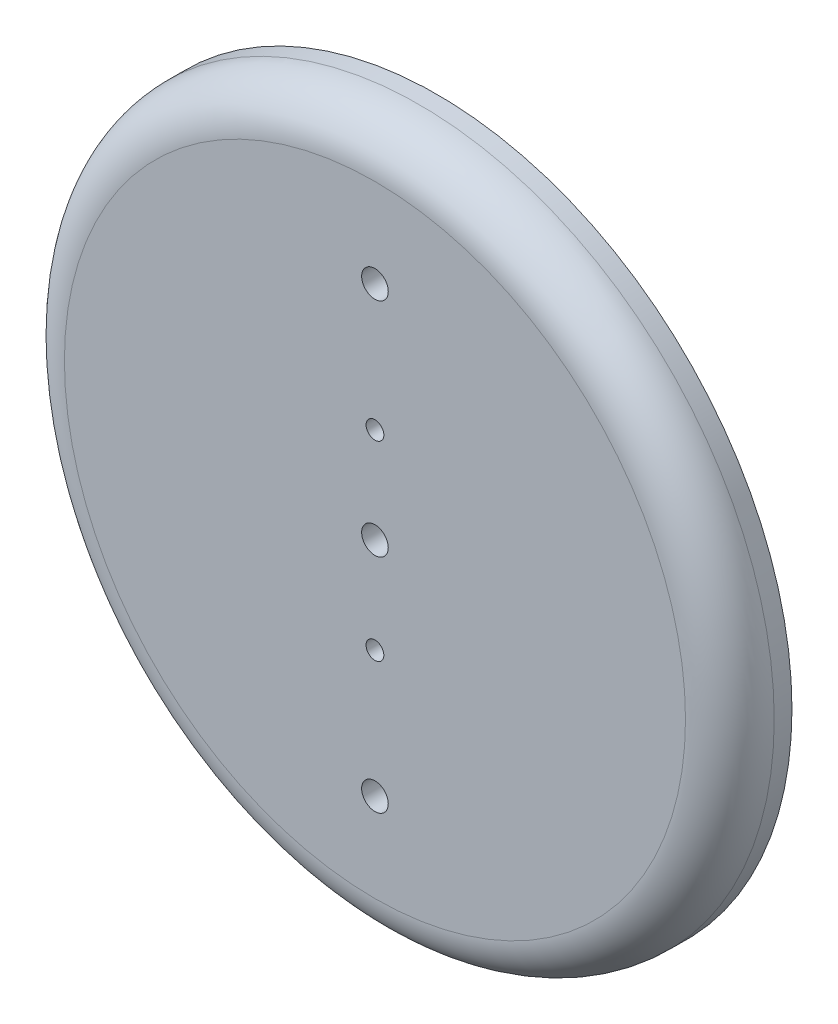
ISO-10303-21;
HEADER;
FILE_DESCRIPTION(('STEP AP214'),'2;1');
FILE_NAME('part.step','',(''),(''),'','','');
FILE_SCHEMA(('AUTOMOTIVE_DESIGN { 1 0 10303 214 1 1 1 1 }'));
ENDSEC;
DATA;
#1=APPLICATION_CONTEXT('core data for automotive mechanical design processes');
#2=APPLICATION_PROTOCOL_DEFINITION('international standard','automotive_design',2000,#1);
#3=PRODUCT_CONTEXT('',#1,'mechanical');
#4=PRODUCT('Part','Part','',(#3));
#5=PRODUCT_RELATED_PRODUCT_CATEGORY('part','',(#4));
#6=PRODUCT_DEFINITION_FORMATION('','',#4);
#7=PRODUCT_DEFINITION_CONTEXT('part definition',#1,'design');
#8=PRODUCT_DEFINITION('design','',#6,#7);
#9=PRODUCT_DEFINITION_SHAPE('','',#8);
#10=(LENGTH_UNIT() NAMED_UNIT(*) SI_UNIT(.MILLI.,.METRE.));
#11=(NAMED_UNIT(*) PLANE_ANGLE_UNIT() SI_UNIT($,.RADIAN.));
#12=(NAMED_UNIT(*) SI_UNIT($,.STERADIAN.) SOLID_ANGLE_UNIT());
#13=UNCERTAINTY_MEASURE_WITH_UNIT(LENGTH_MEASURE(1.E-05),#10,'distance_accuracy_value','');
#14=(GEOMETRIC_REPRESENTATION_CONTEXT(3) GLOBAL_UNCERTAINTY_ASSIGNED_CONTEXT((#13)) GLOBAL_UNIT_ASSIGNED_CONTEXT((#10,
#11,#12)) REPRESENTATION_CONTEXT('',''));
#15=CARTESIAN_POINT('',(0.,0.,0.));
#16=DIRECTION('',(0.,0.,1.));
#17=DIRECTION('',(1.,0.,0.));
#18=AXIS2_PLACEMENT_3D('',#15,#16,#17);
#19=CARTESIAN_POINT('',(0.,0.,7.));
#20=DIRECTION('',(0.,0.,-1.));
#21=DIRECTION('',(-1.,0.,0.));
#22=AXIS2_PLACEMENT_3D('',#19,#20,#21);
#23=CYLINDRICAL_SURFACE('',#22,40.);
#24=CARTESIAN_POINT('',(0.,0.,2.));
#25=DIRECTION('',(0.,0.,1.));
#26=DIRECTION('',(1.,0.,0.));
#27=AXIS2_PLACEMENT_3D('',#24,#25,#26);
#28=CIRCLE('',#27,40.);
#29=CARTESIAN_POINT('',(40.,0.,2.));
#30=VERTEX_POINT('',#29);
#31=EDGE_CURVE('E10',#30,#30,#28,.F.);
#32=ORIENTED_EDGE('',*,*,#31,.T.);
#33=EDGE_LOOP('',(#32));
#34=FACE_BOUND('',#33,.T.);
#35=CARTESIAN_POINT('',(0.,0.,0.));
#36=DIRECTION('',(0.,0.,1.));
#37=DIRECTION('',(1.,0.,0.));
#38=AXIS2_PLACEMENT_3D('',#35,#36,#37);
#39=CIRCLE('',#38,40.);
#40=CARTESIAN_POINT('',(40.,0.,0.));
#41=VERTEX_POINT('',#40);
#42=EDGE_CURVE('E54',#41,#41,#39,.T.);
#43=ORIENTED_EDGE('',*,*,#42,.T.);
#44=EDGE_LOOP('',(#43));
#45=FACE_BOUND('',#44,.T.);
#46=ADVANCED_FACE('F39',(#34,#45),#23,.T.);
#47=CARTESIAN_POINT('',(0.,0.,7.));
#48=DIRECTION('',(0.,0.,1.));
#49=DIRECTION('',(1.,0.,0.));
#50=AXIS2_PLACEMENT_3D('',#47,#48,#49);
#51=PLANE('',#50);
#52=CARTESIAN_POINT('',(0.,0.,7.));
#53=DIRECTION('',(0.,0.,1.));
#54=DIRECTION('',(1.,0.,0.));
#55=AXIS2_PLACEMENT_3D('',#52,#53,#54);
#56=CIRCLE('',#55,1.5);
#57=CARTESIAN_POINT('',(1.5,0.,7.));
#58=VERTEX_POINT('',#57);
#59=EDGE_CURVE('E198',#58,#58,#56,.T.);
#60=ORIENTED_EDGE('',*,*,#59,.F.);
#61=EDGE_LOOP('',(#60));
#62=FACE_BOUND('',#61,.T.);
#63=CARTESIAN_POINT('',(0.,10.75,7.));
#64=DIRECTION('',(0.,0.,1.));
#65=DIRECTION('',(1.,0.,0.));
#66=AXIS2_PLACEMENT_3D('',#63,#64,#65);
#67=CIRCLE('',#66,1.);
#68=CARTESIAN_POINT('',(1.,10.75,7.));
#69=VERTEX_POINT('',#68);
#70=EDGE_CURVE('E71',#69,#69,#67,.T.);
#71=ORIENTED_EDGE('',*,*,#70,.F.);
#72=EDGE_LOOP('',(#71));
#73=FACE_BOUND('',#72,.T.);
#74=CARTESIAN_POINT('',(0.,-10.75,7.));
#75=DIRECTION('',(0.,0.,1.));
#76=DIRECTION('',(-1.,0.,0.));
#77=AXIS2_PLACEMENT_3D('',#74,#75,#76);
#78=CIRCLE('',#77,1.);
#79=CARTESIAN_POINT('',(-1.,-10.75,7.));
#80=VERTEX_POINT('',#79);
#81=EDGE_CURVE('E189',#80,#80,#78,.T.);
#82=ORIENTED_EDGE('',*,*,#81,.F.);
#83=EDGE_LOOP('',(#82));
#84=FACE_BOUND('',#83,.T.);
#85=CARTESIAN_POINT('',(0.,25.,7.));
#86=DIRECTION('',(0.,0.,1.));
#87=DIRECTION('',(1.,0.,0.));
#88=AXIS2_PLACEMENT_3D('',#85,#86,#87);
#89=CIRCLE('',#88,1.5);
#90=CARTESIAN_POINT('',(1.5,25.,7.));
#91=VERTEX_POINT('',#90);
#92=EDGE_CURVE('E63',#91,#91,#89,.T.);
#93=ORIENTED_EDGE('',*,*,#92,.F.);
#94=EDGE_LOOP('',(#93));
#95=FACE_BOUND('',#94,.T.);
#96=CARTESIAN_POINT('',(0.,-25.,7.));
#97=DIRECTION('',(0.,0.,1.));
#98=DIRECTION('',(-1.,0.,0.));
#99=AXIS2_PLACEMENT_3D('',#96,#97,#98);
#100=CIRCLE('',#99,1.5);
#101=CARTESIAN_POINT('',(-1.5,-25.,7.));
#102=VERTEX_POINT('',#101);
#103=EDGE_CURVE('E74',#102,#102,#100,.T.);
#104=ORIENTED_EDGE('',*,*,#103,.F.);
#105=EDGE_LOOP('',(#104));
#106=FACE_BOUND('',#105,.T.);
#107=CARTESIAN_POINT('',(0.,0.,7.));
#108=DIRECTION('',(0.,0.,1.));
#109=DIRECTION('',(1.,0.,0.));
#110=AXIS2_PLACEMENT_3D('',#107,#108,#109);
#111=CIRCLE('',#110,35.);
#112=CARTESIAN_POINT('',(35.,0.,7.));
#113=VERTEX_POINT('',#112);
#114=EDGE_CURVE('E48',#113,#113,#111,.T.);
#115=ORIENTED_EDGE('',*,*,#114,.T.);
#116=EDGE_LOOP('',(#115));
#117=FACE_BOUND('',#116,.T.);
#118=ADVANCED_FACE('F93',(#62,#73,#84,#95,#106,#117),#51,.T.);
#119=CARTESIAN_POINT('',(0.,0.,0.));
#120=DIRECTION('',(0.,0.,1.));
#121=DIRECTION('',(1.,0.,0.));
#122=AXIS2_PLACEMENT_3D('',#119,#120,#121);
#123=PLANE('',#122);
#124=CARTESIAN_POINT('',(0.,0.,0.));
#125=DIRECTION('',(0.,0.,1.));
#126=DIRECTION('',(1.,0.,0.));
#127=AXIS2_PLACEMENT_3D('',#124,#125,#126);
#128=CIRCLE('',#127,1.5);
#129=CARTESIAN_POINT('',(1.5,0.,0.));
#130=VERTEX_POINT('',#129);
#131=EDGE_CURVE('E43',#130,#130,#128,.T.);
#132=ORIENTED_EDGE('',*,*,#131,.T.);
#133=EDGE_LOOP('',(#132));
#134=FACE_BOUND('',#133,.T.);
#135=CARTESIAN_POINT('',(0.,10.75,0.));
#136=DIRECTION('',(0.,0.,1.));
#137=DIRECTION('',(1.,0.,0.));
#138=AXIS2_PLACEMENT_3D('',#135,#136,#137);
#139=CIRCLE('',#138,1.);
#140=CARTESIAN_POINT('',(1.,10.75,0.));
#141=VERTEX_POINT('',#140);
#142=EDGE_CURVE('E70',#141,#141,#139,.T.);
#143=ORIENTED_EDGE('',*,*,#142,.T.);
#144=EDGE_LOOP('',(#143));
#145=FACE_BOUND('',#144,.T.);
#146=CARTESIAN_POINT('',(0.,-10.75,0.));
#147=DIRECTION('',(0.,0.,1.));
#148=DIRECTION('',(1.,0.,0.));
#149=AXIS2_PLACEMENT_3D('',#146,#147,#148);
#150=CIRCLE('',#149,1.);
#151=CARTESIAN_POINT('',(1.,-10.75,0.));
#152=VERTEX_POINT('',#151);
#153=EDGE_CURVE('E67',#152,#152,#150,.T.);
#154=ORIENTED_EDGE('',*,*,#153,.T.);
#155=EDGE_LOOP('',(#154));
#156=FACE_BOUND('',#155,.T.);
#157=CARTESIAN_POINT('',(0.,25.,0.));
#158=DIRECTION('',(0.,0.,1.));
#159=DIRECTION('',(1.,0.,0.));
#160=AXIS2_PLACEMENT_3D('',#157,#158,#159);
#161=CIRCLE('',#160,1.5);
#162=CARTESIAN_POINT('',(1.5,25.,0.));
#163=VERTEX_POINT('',#162);
#164=EDGE_CURVE('E62',#163,#163,#161,.T.);
#165=ORIENTED_EDGE('',*,*,#164,.T.);
#166=EDGE_LOOP('',(#165));
#167=FACE_BOUND('',#166,.T.);
#168=CARTESIAN_POINT('',(0.,-25.,0.));
#169=DIRECTION('',(0.,0.,1.));
#170=DIRECTION('',(1.,0.,0.));
#171=AXIS2_PLACEMENT_3D('',#168,#169,#170);
#172=CIRCLE('',#171,1.5);
#173=CARTESIAN_POINT('',(1.5,-25.,0.));
#174=VERTEX_POINT('',#173);
#175=EDGE_CURVE('E58',#174,#174,#172,.T.);
#176=ORIENTED_EDGE('',*,*,#175,.T.);
#177=EDGE_LOOP('',(#176));
#178=FACE_BOUND('',#177,.T.);
#179=ORIENTED_EDGE('',*,*,#42,.F.);
#180=EDGE_LOOP('',(#179));
#181=FACE_BOUND('',#180,.T.);
#182=ADVANCED_FACE('F91',(#134,#145,#156,#167,#178,#181),#123,.F.);
#183=CARTESIAN_POINT('',(0.,0.,2.));
#184=DIRECTION('',(0.,0.,1.));
#185=DIRECTION('',(1.,0.,0.));
#186=AXIS2_PLACEMENT_3D('',#183,#184,#185);
#187=TOROIDAL_SURFACE('',#186,35.,5.);
#188=ORIENTED_EDGE('',*,*,#31,.F.);
#189=EDGE_LOOP('',(#188));
#190=FACE_BOUND('',#189,.T.);
#191=ORIENTED_EDGE('',*,*,#114,.F.);
#192=EDGE_LOOP('',(#191));
#193=FACE_BOUND('',#192,.T.);
#194=ADVANCED_FACE('F41',(#190,#193),#187,.T.);
#195=CARTESIAN_POINT('',(0.,-25.,-30.));
#196=DIRECTION('',(0.,0.,1.));
#197=DIRECTION('',(1.,0.,0.));
#198=AXIS2_PLACEMENT_3D('',#195,#196,#197);
#199=CYLINDRICAL_SURFACE('',#198,1.5);
#200=ORIENTED_EDGE('',*,*,#103,.T.);
#201=EDGE_LOOP('',(#200));
#202=FACE_BOUND('',#201,.T.);
#203=ORIENTED_EDGE('',*,*,#175,.F.);
#204=EDGE_LOOP('',(#203));
#205=FACE_BOUND('',#204,.T.);
#206=ADVANCED_FACE('F100',(#202,#205),#199,.F.);
#207=CARTESIAN_POINT('',(0.,25.,-30.));
#208=DIRECTION('',(0.,0.,1.));
#209=DIRECTION('',(1.,0.,0.));
#210=AXIS2_PLACEMENT_3D('',#207,#208,#209);
#211=CYLINDRICAL_SURFACE('',#210,1.5);
#212=ORIENTED_EDGE('',*,*,#92,.T.);
#213=EDGE_LOOP('',(#212));
#214=FACE_BOUND('',#213,.T.);
#215=ORIENTED_EDGE('',*,*,#164,.F.);
#216=EDGE_LOOP('',(#215));
#217=FACE_BOUND('',#216,.T.);
#218=ADVANCED_FACE('F145',(#214,#217),#211,.F.);
#219=CARTESIAN_POINT('',(0.,-10.75,-3.));
#220=DIRECTION('',(0.,0.,1.));
#221=DIRECTION('',(1.,0.,0.));
#222=AXIS2_PLACEMENT_3D('',#219,#220,#221);
#223=CYLINDRICAL_SURFACE('',#222,1.);
#224=ORIENTED_EDGE('',*,*,#81,.T.);
#225=EDGE_LOOP('',(#224));
#226=FACE_BOUND('',#225,.T.);
#227=ORIENTED_EDGE('',*,*,#153,.F.);
#228=EDGE_LOOP('',(#227));
#229=FACE_BOUND('',#228,.T.);
#230=ADVANCED_FACE('F140',(#226,#229),#223,.F.);
#231=CARTESIAN_POINT('',(0.,10.75,-3.));
#232=DIRECTION('',(0.,0.,1.));
#233=DIRECTION('',(1.,0.,0.));
#234=AXIS2_PLACEMENT_3D('',#231,#232,#233);
#235=CYLINDRICAL_SURFACE('',#234,1.);
#236=ORIENTED_EDGE('',*,*,#70,.T.);
#237=EDGE_LOOP('',(#236));
#238=FACE_BOUND('',#237,.T.);
#239=ORIENTED_EDGE('',*,*,#142,.F.);
#240=EDGE_LOOP('',(#239));
#241=FACE_BOUND('',#240,.T.);
#242=ADVANCED_FACE('F119',(#238,#241),#235,.F.);
#243=CARTESIAN_POINT('',(0.,0.,-3.));
#244=DIRECTION('',(0.,0.,1.));
#245=DIRECTION('',(1.,0.,0.));
#246=AXIS2_PLACEMENT_3D('',#243,#244,#245);
#247=CYLINDRICAL_SURFACE('',#246,1.5);
#248=ORIENTED_EDGE('',*,*,#59,.T.);
#249=EDGE_LOOP('',(#248));
#250=FACE_BOUND('',#249,.T.);
#251=ORIENTED_EDGE('',*,*,#131,.F.);
#252=EDGE_LOOP('',(#251));
#253=FACE_BOUND('',#252,.T.);
#254=ADVANCED_FACE('F129',(#250,#253),#247,.F.);
#255=CLOSED_SHELL('',(#46,#118,#182,#194,#206,#218,#230,#242,#254));
#256=MANIFOLD_SOLID_BREP('B2',#255);
#257=ADVANCED_BREP_SHAPE_REPRESENTATION('',(#18,#256),#14);
#258=SHAPE_DEFINITION_REPRESENTATION(#9,#257);
ENDSEC;
END-ISO-10303-21;
